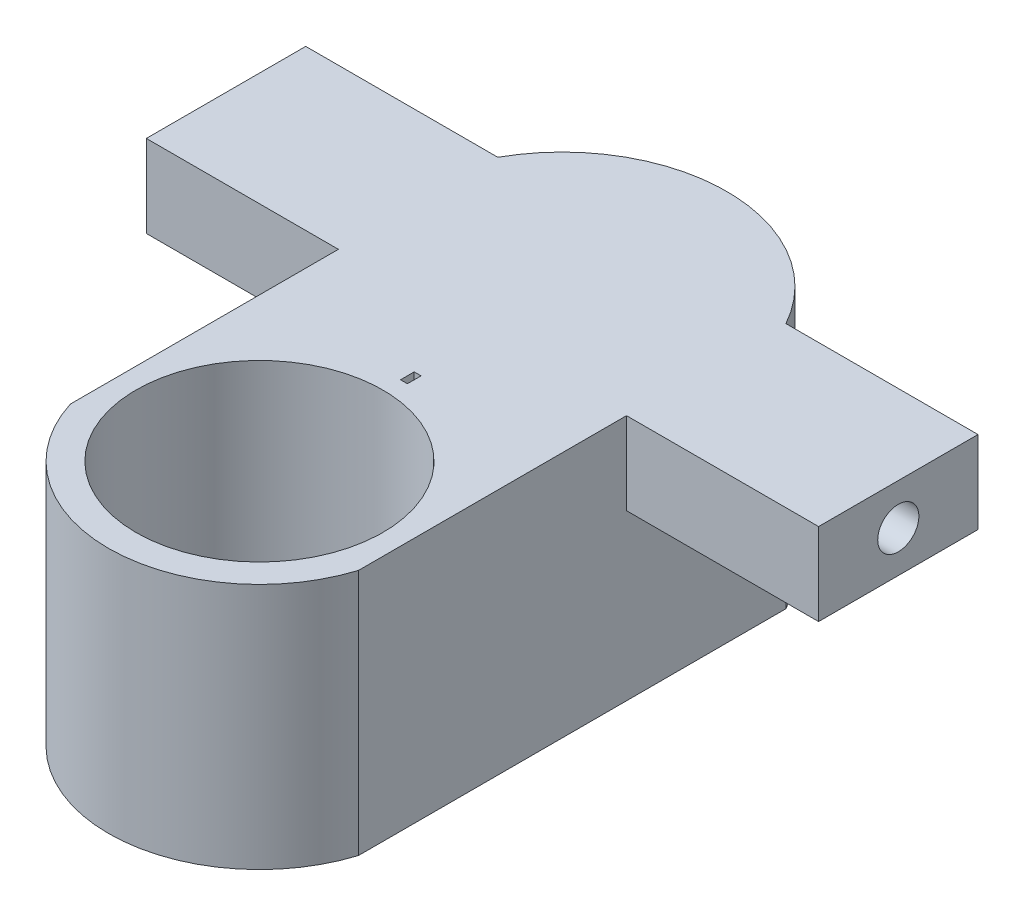
ISO-10303-21;
HEADER;
FILE_DESCRIPTION(('STEP AP214'),'2;1');
FILE_NAME('part.step','',(''),(''),'','','');
FILE_SCHEMA(('AUTOMOTIVE_DESIGN { 1 0 10303 214 1 1 1 1 }'));
ENDSEC;
DATA;
#1=APPLICATION_CONTEXT('core data for automotive mechanical design processes');
#2=APPLICATION_PROTOCOL_DEFINITION('international standard','automotive_design',2000,#1);
#3=PRODUCT_CONTEXT('',#1,'mechanical');
#4=PRODUCT('Part','Part','',(#3));
#5=PRODUCT_RELATED_PRODUCT_CATEGORY('part','',(#4));
#6=PRODUCT_DEFINITION_FORMATION('','',#4);
#7=PRODUCT_DEFINITION_CONTEXT('part definition',#1,'design');
#8=PRODUCT_DEFINITION('design','',#6,#7);
#9=PRODUCT_DEFINITION_SHAPE('','',#8);
#10=(LENGTH_UNIT() NAMED_UNIT(*) SI_UNIT(.MILLI.,.METRE.));
#11=(NAMED_UNIT(*) PLANE_ANGLE_UNIT() SI_UNIT($,.RADIAN.));
#12=(NAMED_UNIT(*) SI_UNIT($,.STERADIAN.) SOLID_ANGLE_UNIT());
#13=UNCERTAINTY_MEASURE_WITH_UNIT(LENGTH_MEASURE(1.E-05),#10,'distance_accuracy_value','');
#14=(GEOMETRIC_REPRESENTATION_CONTEXT(3) GLOBAL_UNCERTAINTY_ASSIGNED_CONTEXT((#13)) GLOBAL_UNIT_ASSIGNED_CONTEXT((#10,
#11,#12)) REPRESENTATION_CONTEXT('',''));
#15=CARTESIAN_POINT('',(0.,0.,0.));
#16=DIRECTION('',(0.,0.,1.));
#17=DIRECTION('',(1.,0.,0.));
#18=AXIS2_PLACEMENT_3D('',#15,#16,#17);
#19=CARTESIAN_POINT('',(-10.5,18.,0.));
#20=DIRECTION('',(-1.,0.,0.));
#21=DIRECTION('',(0.,0.,1.));
#22=AXIS2_PLACEMENT_3D('',#19,#20,#21);
#23=PLANE('',#22);
#24=DIRECTION('',(0.,0.,-1.));
#25=VECTOR('',#24,1.);
#26=CARTESIAN_POINT('',(-10.5,18.,0.));
#27=LINE('',#26,#25);
#28=CARTESIAN_POINT('',(-10.5,18.,25.3438942865219));
#29=VERTEX_POINT('',#28);
#30=CARTESIAN_POINT('',(-10.5,18.,5.80947501931112));
#31=VERTEX_POINT('',#30);
#32=EDGE_CURVE('E354',#29,#31,#27,.T.);
#33=ORIENTED_EDGE('',*,*,#32,.T.);
#34=DIRECTION('',(0.,-1.,0.));
#35=VECTOR('',#34,1.);
#36=CARTESIAN_POINT('',(-10.5,0.,5.80947501931112));
#37=LINE('',#36,#35);
#38=CARTESIAN_POINT('',(-10.5,12.,5.80947501931112));
#39=VERTEX_POINT('',#38);
#40=EDGE_CURVE('E535',#31,#39,#37,.T.);
#41=ORIENTED_EDGE('',*,*,#40,.T.);
#42=DIRECTION('',(0.,0.,1.));
#43=VECTOR('',#42,1.);
#44=CARTESIAN_POINT('',(-10.5,12.,0.));
#45=LINE('',#44,#43);
#46=CARTESIAN_POINT('',(-10.5,12.,-5.80947501931112));
#47=VERTEX_POINT('',#46);
#48=EDGE_CURVE('E549',#47,#39,#45,.T.);
#49=ORIENTED_EDGE('',*,*,#48,.F.);
#50=DIRECTION('',(0.,1.,0.));
#51=VECTOR('',#50,1.);
#52=CARTESIAN_POINT('',(-10.5,-34.,-5.80947501931112));
#53=LINE('',#52,#51);
#54=CARTESIAN_POINT('',(-10.5,0.,-5.80947501931112));
#55=VERTEX_POINT('',#54);
#56=EDGE_CURVE('E587',#55,#47,#53,.T.);
#57=ORIENTED_EDGE('',*,*,#56,.F.);
#58=DIRECTION('',(0.,0.,-1.));
#59=VECTOR('',#58,1.);
#60=CARTESIAN_POINT('',(-10.5,0.,0.));
#61=LINE('',#60,#59);
#62=CARTESIAN_POINT('',(-10.5,0.,25.3438942865219));
#63=VERTEX_POINT('',#62);
#64=EDGE_CURVE('E622',#63,#55,#61,.T.);
#65=ORIENTED_EDGE('',*,*,#64,.F.);
#66=DIRECTION('',(0.,1.,0.));
#67=VECTOR('',#66,1.);
#68=CARTESIAN_POINT('',(-10.5,-34.,25.3438942865219));
#69=LINE('',#68,#67);
#70=EDGE_CURVE('E594',#63,#29,#69,.T.);
#71=ORIENTED_EDGE('',*,*,#70,.T.);
#72=EDGE_LOOP('',(#33,#41,#49,#57,#65,#71));
#73=FACE_BOUND('',#72,.T.);
#74=ADVANCED_FACE('F345',(#73),#23,.T.);
#75=CARTESIAN_POINT('',(0.,0.,0.));
#76=DIRECTION('',(0.,1.,0.));
#77=DIRECTION('',(0.,0.,1.));
#78=AXIS2_PLACEMENT_3D('',#75,#76,#77);
#79=PLANE('',#78);
#80=CARTESIAN_POINT('',(0.,0.,22.0651750243709));
#81=DIRECTION('',(0.,1.,0.));
#82=DIRECTION('',(0.,0.,1.));
#83=AXIS2_PLACEMENT_3D('',#80,#81,#82);
#84=CIRCLE('',#83,9.);
#85=CARTESIAN_POINT('',(0.,0.,31.0651750243709));
#86=VERTEX_POINT('',#85);
#87=EDGE_CURVE('E614',#86,#86,#84,.T.);
#88=ORIENTED_EDGE('',*,*,#87,.T.);
#89=EDGE_LOOP('',(#88));
#90=FACE_BOUND('',#89,.T.);
#91=CARTESIAN_POINT('',(0.,0.,0.));
#92=DIRECTION('',(0.,1.,0.));
#93=DIRECTION('',(0.,0.,1.));
#94=AXIS2_PLACEMENT_3D('',#91,#92,#93);
#95=CIRCLE('',#94,12.);
#96=CARTESIAN_POINT('',(10.5,0.,-5.80947501931112));
#97=VERTEX_POINT('',#96);
#98=EDGE_CURVE('E591',#97,#55,#95,.T.);
#99=ORIENTED_EDGE('',*,*,#98,.F.);
#100=DIRECTION('',(0.,0.,1.));
#101=VECTOR('',#100,1.);
#102=CARTESIAN_POINT('',(10.5,0.,0.));
#103=LINE('',#102,#101);
#104=CARTESIAN_POINT('',(10.5,0.,25.3438942865219));
#105=VERTEX_POINT('',#104);
#106=EDGE_CURVE('E618',#97,#105,#103,.T.);
#107=ORIENTED_EDGE('',*,*,#106,.T.);
#108=CARTESIAN_POINT('',(0.,0.,22.0651750243709));
#109=DIRECTION('',(0.,1.,0.));
#110=DIRECTION('',(0.,0.,1.));
#111=AXIS2_PLACEMENT_3D('',#108,#109,#110);
#112=CIRCLE('',#111,11.);
#113=EDGE_CURVE('E610',#63,#105,#112,.T.);
#114=ORIENTED_EDGE('',*,*,#113,.F.);
#115=ORIENTED_EDGE('',*,*,#64,.T.);
#116=EDGE_LOOP('',(#99,#107,#114,#115));
#117=FACE_BOUND('',#116,.T.);
#118=ADVANCED_FACE('F630',(#90,#117),#79,.F.);
#119=CARTESIAN_POINT('',(0.,18.,0.));
#120=DIRECTION('',(0.,1.,0.));
#121=DIRECTION('',(0.,0.,1.));
#122=AXIS2_PLACEMENT_3D('',#119,#120,#121);
#123=PLANE('',#122);
#124=DIRECTION('',(0.,0.,-1.));
#125=VECTOR('',#124,1.);
#126=CARTESIAN_POINT('',(0.500000000000005,18.,0.));
#127=LINE('',#126,#125);
#128=CARTESIAN_POINT('',(0.500000000000005,18.,11.7825875121855));
#129=VERTEX_POINT('',#128);
#130=CARTESIAN_POINT('',(0.500000000000005,18.,10.7825875121855));
#131=VERTEX_POINT('',#130);
#132=EDGE_CURVE('E369',#129,#131,#127,.T.);
#133=ORIENTED_EDGE('',*,*,#132,.F.);
#134=DIRECTION('',(1.,0.,0.));
#135=VECTOR('',#134,1.);
#136=CARTESIAN_POINT('',(0.,18.,11.7825875121855));
#137=LINE('',#136,#135);
#138=CARTESIAN_POINT('',(0.,18.,11.7825875121855));
#139=VERTEX_POINT('',#138);
#140=EDGE_CURVE('E506',#139,#129,#137,.T.);
#141=ORIENTED_EDGE('',*,*,#140,.F.);
#142=DIRECTION('',(0.,0.,1.));
#143=VECTOR('',#142,1.);
#144=CARTESIAN_POINT('',(0.,18.,0.));
#145=LINE('',#144,#143);
#146=CARTESIAN_POINT('',(0.,18.,10.7825875121855));
#147=VERTEX_POINT('',#146);
#148=EDGE_CURVE('E525',#147,#139,#145,.T.);
#149=ORIENTED_EDGE('',*,*,#148,.F.);
#150=DIRECTION('',(-1.,0.,0.));
#151=VECTOR('',#150,1.);
#152=CARTESIAN_POINT('',(0.,18.,10.7825875121855));
#153=LINE('',#152,#151);
#154=EDGE_CURVE('E521',#131,#147,#153,.T.);
#155=ORIENTED_EDGE('',*,*,#154,.F.);
#156=EDGE_LOOP('',(#133,#141,#149,#155));
#157=FACE_BOUND('',#156,.T.);
#158=CARTESIAN_POINT('',(0.,18.,22.0651750243709));
#159=DIRECTION('',(0.,1.,0.));
#160=DIRECTION('',(0.,0.,1.));
#161=AXIS2_PLACEMENT_3D('',#158,#159,#160);
#162=CIRCLE('',#161,9.);
#163=CARTESIAN_POINT('',(0.,18.,31.0651750243709));
#164=VERTEX_POINT('',#163);
#165=EDGE_CURVE('E606',#164,#164,#162,.T.);
#166=ORIENTED_EDGE('',*,*,#165,.F.);
#167=EDGE_LOOP('',(#166));
#168=FACE_BOUND('',#167,.T.);
#169=DIRECTION('',(0.,0.,1.));
#170=VECTOR('',#169,1.);
#171=CARTESIAN_POINT('',(10.5,18.,0.));
#172=LINE('',#171,#170);
#173=CARTESIAN_POINT('',(10.5,18.,5.8094750193111));
#174=VERTEX_POINT('',#173);
#175=CARTESIAN_POINT('',(10.5,18.,25.3438942865219));
#176=VERTEX_POINT('',#175);
#177=EDGE_CURVE('E619',#174,#176,#172,.T.);
#178=ORIENTED_EDGE('',*,*,#177,.F.);
#179=DIRECTION('',(-1.,0.,0.));
#180=VECTOR('',#179,1.);
#181=CARTESIAN_POINT('',(24.5,18.,5.80947501931107));
#182=LINE('',#181,#180);
#183=CARTESIAN_POINT('',(24.5,18.,5.80947501931107));
#184=VERTEX_POINT('',#183);
#185=EDGE_CURVE('E484',#184,#174,#182,.T.);
#186=ORIENTED_EDGE('',*,*,#185,.F.);
#187=DIRECTION('',(0.,0.,-1.));
#188=VECTOR('',#187,1.);
#189=CARTESIAN_POINT('',(24.5,18.,0.));
#190=LINE('',#189,#188);
#191=CARTESIAN_POINT('',(24.5,18.,-5.80947501931117));
#192=VERTEX_POINT('',#191);
#193=EDGE_CURVE('E462',#184,#192,#190,.T.);
#194=ORIENTED_EDGE('',*,*,#193,.T.);
#195=DIRECTION('',(-1.,0.,0.));
#196=VECTOR('',#195,1.);
#197=CARTESIAN_POINT('',(24.5,18.,-5.80947501931117));
#198=LINE('',#197,#196);
#199=CARTESIAN_POINT('',(10.5,18.,-5.80947501931114));
#200=VERTEX_POINT('',#199);
#201=EDGE_CURVE('E496',#192,#200,#198,.T.);
#202=ORIENTED_EDGE('',*,*,#201,.T.);
#203=CARTESIAN_POINT('',(0.,18.,0.));
#204=DIRECTION('',(0.,1.,0.));
#205=DIRECTION('',(0.,0.,1.));
#206=AXIS2_PLACEMENT_3D('',#203,#204,#205);
#207=CIRCLE('',#206,12.);
#208=CARTESIAN_POINT('',(-10.5,18.,-5.80947501931112));
#209=VERTEX_POINT('',#208);
#210=EDGE_CURVE('E583',#200,#209,#207,.T.);
#211=ORIENTED_EDGE('',*,*,#210,.T.);
#212=DIRECTION('',(1.,0.,0.));
#213=VECTOR('',#212,1.);
#214=CARTESIAN_POINT('',(-24.5,18.,-5.80947501931112));
#215=LINE('',#214,#213);
#216=CARTESIAN_POINT('',(-24.5,18.,-5.80947501931112));
#217=VERTEX_POINT('',#216);
#218=EDGE_CURVE('E575',#217,#209,#215,.T.);
#219=ORIENTED_EDGE('',*,*,#218,.F.);
#220=DIRECTION('',(0.,0.,-1.));
#221=VECTOR('',#220,1.);
#222=CARTESIAN_POINT('',(-24.5,18.,0.));
#223=LINE('',#222,#221);
#224=CARTESIAN_POINT('',(-24.5,18.,5.80947501931112));
#225=VERTEX_POINT('',#224);
#226=EDGE_CURVE('E548',#225,#217,#223,.T.);
#227=ORIENTED_EDGE('',*,*,#226,.F.);
#228=DIRECTION('',(1.,0.,0.));
#229=VECTOR('',#228,1.);
#230=CARTESIAN_POINT('',(-24.5,18.,5.80947501931112));
#231=LINE('',#230,#229);
#232=EDGE_CURVE('E579',#225,#31,#231,.T.);
#233=ORIENTED_EDGE('',*,*,#232,.T.);
#234=ORIENTED_EDGE('',*,*,#32,.F.);
#235=CARTESIAN_POINT('',(0.,18.,22.0651750243709));
#236=DIRECTION('',(0.,1.,0.));
#237=DIRECTION('',(0.,0.,1.));
#238=AXIS2_PLACEMENT_3D('',#235,#236,#237);
#239=CIRCLE('',#238,11.);
#240=EDGE_CURVE('E598',#29,#176,#239,.T.);
#241=ORIENTED_EDGE('',*,*,#240,.T.);
#242=EDGE_LOOP('',(#178,#186,#194,#202,#211,#219,#227,#233,#234,#241));
#243=FACE_BOUND('',#242,.T.);
#244=ADVANCED_FACE('F654',(#157,#168,#243),#123,.T.);
#245=CARTESIAN_POINT('',(10.5,18.,0.));
#246=DIRECTION('',(1.,0.,0.));
#247=DIRECTION('',(0.,0.,-1.));
#248=AXIS2_PLACEMENT_3D('',#245,#246,#247);
#249=PLANE('',#248);
#250=DIRECTION('',(0.,-1.,0.));
#251=VECTOR('',#250,1.);
#252=CARTESIAN_POINT('',(10.5,0.,5.8094750193111));
#253=LINE('',#252,#251);
#254=CARTESIAN_POINT('',(10.5,12.,5.8094750193111));
#255=VERTEX_POINT('',#254);
#256=EDGE_CURVE('E361',#174,#255,#253,.T.);
#257=ORIENTED_EDGE('',*,*,#256,.F.);
#258=ORIENTED_EDGE('',*,*,#177,.T.);
#259=DIRECTION('',(0.,1.,0.));
#260=VECTOR('',#259,1.);
#261=CARTESIAN_POINT('',(10.5,-34.,25.3438942865219));
#262=LINE('',#261,#260);
#263=EDGE_CURVE('E602',#105,#176,#262,.T.);
#264=ORIENTED_EDGE('',*,*,#263,.F.);
#265=ORIENTED_EDGE('',*,*,#106,.F.);
#266=DIRECTION('',(0.,1.,0.));
#267=VECTOR('',#266,1.);
#268=CARTESIAN_POINT('',(10.5,-34.,-5.80947501931112));
#269=LINE('',#268,#267);
#270=CARTESIAN_POINT('',(10.5,12.,-5.80947501931114));
#271=VERTEX_POINT('',#270);
#272=EDGE_CURVE('E12',#97,#271,#269,.T.);
#273=ORIENTED_EDGE('',*,*,#272,.T.);
#274=DIRECTION('',(0.,0.,1.));
#275=VECTOR('',#274,1.);
#276=CARTESIAN_POINT('',(10.5,12.,0.));
#277=LINE('',#276,#275);
#278=EDGE_CURVE('E487',#271,#255,#277,.T.);
#279=ORIENTED_EDGE('',*,*,#278,.T.);
#280=EDGE_LOOP('',(#257,#258,#264,#265,#273,#279));
#281=FACE_BOUND('',#280,.T.);
#282=ADVANCED_FACE('F347',(#281),#249,.T.);
#283=CARTESIAN_POINT('',(0.,-34.,22.0651750243709));
#284=DIRECTION('',(0.,1.,0.));
#285=DIRECTION('',(0.,0.,1.));
#286=AXIS2_PLACEMENT_3D('',#283,#284,#285);
#287=CYLINDRICAL_SURFACE('',#286,11.);
#288=ORIENTED_EDGE('',*,*,#113,.T.);
#289=ORIENTED_EDGE('',*,*,#263,.T.);
#290=ORIENTED_EDGE('',*,*,#240,.F.);
#291=ORIENTED_EDGE('',*,*,#70,.F.);
#292=EDGE_LOOP('',(#288,#289,#290,#291));
#293=FACE_BOUND('',#292,.T.);
#294=ADVANCED_FACE('F661',(#293),#287,.T.);
#295=CARTESIAN_POINT('',(0.,-34.,22.0651750243709));
#296=DIRECTION('',(0.,1.,0.));
#297=DIRECTION('',(0.,0.,1.));
#298=AXIS2_PLACEMENT_3D('',#295,#296,#297);
#299=CYLINDRICAL_SURFACE('',#298,9.);
#300=ORIENTED_EDGE('',*,*,#165,.T.);
#301=EDGE_LOOP('',(#300));
#302=FACE_BOUND('',#301,.T.);
#303=ORIENTED_EDGE('',*,*,#87,.F.);
#304=EDGE_LOOP('',(#303));
#305=FACE_BOUND('',#304,.T.);
#306=ADVANCED_FACE('F672',(#302,#305),#299,.F.);
#307=CARTESIAN_POINT('',(0.,-34.,0.));
#308=DIRECTION('',(0.,1.,0.));
#309=DIRECTION('',(0.,0.,1.));
#310=AXIS2_PLACEMENT_3D('',#307,#308,#309);
#311=CYLINDRICAL_SURFACE('',#310,12.);
#312=ORIENTED_EDGE('',*,*,#98,.T.);
#313=ORIENTED_EDGE('',*,*,#56,.T.);
#314=DIRECTION('',(0.,-1.,0.));
#315=VECTOR('',#314,1.);
#316=CARTESIAN_POINT('',(-10.5,0.,-5.80947501931112));
#317=LINE('',#316,#315);
#318=EDGE_CURVE('E561',#209,#47,#317,.T.);
#319=ORIENTED_EDGE('',*,*,#318,.F.);
#320=ORIENTED_EDGE('',*,*,#210,.F.);
#321=DIRECTION('',(0.,-1.,0.));
#322=VECTOR('',#321,1.);
#323=CARTESIAN_POINT('',(10.5,0.,-5.80947501931114));
#324=LINE('',#323,#322);
#325=EDGE_CURVE('E464',#200,#271,#324,.T.);
#326=ORIENTED_EDGE('',*,*,#325,.T.);
#327=ORIENTED_EDGE('',*,*,#272,.F.);
#328=EDGE_LOOP('',(#312,#313,#319,#320,#326,#327));
#329=FACE_BOUND('',#328,.T.);
#330=ADVANCED_FACE('F637',(#329),#311,.T.);
#331=CARTESIAN_POINT('',(-24.5,0.,5.80947501931112));
#332=DIRECTION('',(0.,0.,1.));
#333=DIRECTION('',(0.,-1.,0.));
#334=AXIS2_PLACEMENT_3D('',#331,#332,#333);
#335=PLANE('',#334);
#336=ORIENTED_EDGE('',*,*,#40,.F.);
#337=ORIENTED_EDGE('',*,*,#232,.F.);
#338=DIRECTION('',(0.,-1.,0.));
#339=VECTOR('',#338,1.);
#340=CARTESIAN_POINT('',(-24.5,0.,5.80947501931112));
#341=LINE('',#340,#339);
#342=CARTESIAN_POINT('',(-24.5,12.,5.80947501931112));
#343=VERTEX_POINT('',#342);
#344=EDGE_CURVE('E544',#225,#343,#341,.T.);
#345=ORIENTED_EDGE('',*,*,#344,.T.);
#346=DIRECTION('',(1.,0.,0.));
#347=VECTOR('',#346,1.);
#348=CARTESIAN_POINT('',(-24.5,12.,5.80947501931112));
#349=LINE('',#348,#347);
#350=EDGE_CURVE('E558',#343,#39,#349,.T.);
#351=ORIENTED_EDGE('',*,*,#350,.T.);
#352=EDGE_LOOP('',(#336,#337,#345,#351));
#353=FACE_BOUND('',#352,.T.);
#354=ADVANCED_FACE('F664',(#353),#335,.T.);
#355=CARTESIAN_POINT('',(-24.5,0.,-5.80947501931112));
#356=DIRECTION('',(0.,0.,1.));
#357=DIRECTION('',(1.,0.,0.));
#358=AXIS2_PLACEMENT_3D('',#355,#356,#357);
#359=PLANE('',#358);
#360=ORIENTED_EDGE('',*,*,#318,.T.);
#361=DIRECTION('',(1.,0.,0.));
#362=VECTOR('',#361,1.);
#363=CARTESIAN_POINT('',(-24.5,12.,-5.80947501931112));
#364=LINE('',#363,#362);
#365=CARTESIAN_POINT('',(-24.5,12.,-5.80947501931112));
#366=VERTEX_POINT('',#365);
#367=EDGE_CURVE('E571',#366,#47,#364,.T.);
#368=ORIENTED_EDGE('',*,*,#367,.F.);
#369=DIRECTION('',(0.,-1.,0.));
#370=VECTOR('',#369,1.);
#371=CARTESIAN_POINT('',(-24.5,0.,-5.80947501931112));
#372=LINE('',#371,#370);
#373=EDGE_CURVE('E552',#217,#366,#372,.T.);
#374=ORIENTED_EDGE('',*,*,#373,.F.);
#375=ORIENTED_EDGE('',*,*,#218,.T.);
#376=EDGE_LOOP('',(#360,#368,#374,#375));
#377=FACE_BOUND('',#376,.T.);
#378=ADVANCED_FACE('F641',(#377),#359,.F.);
#379=CARTESIAN_POINT('',(-24.5,12.,0.));
#380=DIRECTION('',(0.,1.,0.));
#381=DIRECTION('',(0.,0.,1.));
#382=AXIS2_PLACEMENT_3D('',#379,#380,#381);
#383=PLANE('',#382);
#384=ORIENTED_EDGE('',*,*,#48,.T.);
#385=ORIENTED_EDGE('',*,*,#350,.F.);
#386=DIRECTION('',(0.,0.,1.));
#387=VECTOR('',#386,1.);
#388=CARTESIAN_POINT('',(-24.5,12.,0.));
#389=LINE('',#388,#387);
#390=EDGE_CURVE('E555',#366,#343,#389,.T.);
#391=ORIENTED_EDGE('',*,*,#390,.F.);
#392=ORIENTED_EDGE('',*,*,#367,.T.);
#393=EDGE_LOOP('',(#384,#385,#391,#392));
#394=FACE_BOUND('',#393,.T.);
#395=ADVANCED_FACE('F646',(#394),#383,.F.);
#396=CARTESIAN_POINT('',(-24.5,0.,0.));
#397=DIRECTION('',(-1.,0.,0.));
#398=DIRECTION('',(0.,0.,1.));
#399=AXIS2_PLACEMENT_3D('',#396,#397,#398);
#400=PLANE('',#399);
#401=CARTESIAN_POINT('',(-24.5,15.,0.));
#402=DIRECTION('',(-1.,0.,0.));
#403=DIRECTION('',(0.,0.,1.));
#404=AXIS2_PLACEMENT_3D('',#401,#402,#403);
#405=CIRCLE('',#404,1.5);
#406=CARTESIAN_POINT('',(-24.5,15.,1.5));
#407=VERTEX_POINT('',#406);
#408=EDGE_CURVE('E989',#407,#407,#405,.T.);
#409=ORIENTED_EDGE('',*,*,#408,.F.);
#410=EDGE_LOOP('',(#409));
#411=FACE_BOUND('',#410,.T.);
#412=ORIENTED_EDGE('',*,*,#344,.F.);
#413=ORIENTED_EDGE('',*,*,#226,.T.);
#414=ORIENTED_EDGE('',*,*,#373,.T.);
#415=ORIENTED_EDGE('',*,*,#390,.T.);
#416=EDGE_LOOP('',(#412,#413,#414,#415));
#417=FACE_BOUND('',#416,.T.);
#418=ADVANCED_FACE('F650',(#411,#417),#400,.T.);
#419=CARTESIAN_POINT('',(0.500000000000005,17.5,0.));
#420=DIRECTION('',(1.,0.,0.));
#421=DIRECTION('',(0.,0.,-1.));
#422=AXIS2_PLACEMENT_3D('',#419,#420,#421);
#423=PLANE('',#422);
#424=ORIENTED_EDGE('',*,*,#132,.T.);
#425=DIRECTION('',(0.,1.,0.));
#426=VECTOR('',#425,1.);
#427=CARTESIAN_POINT('',(0.500000000000005,17.5,10.7825875121855));
#428=LINE('',#427,#426);
#429=CARTESIAN_POINT('',(0.500000000000005,17.5,10.7825875121855));
#430=VERTEX_POINT('',#429);
#431=EDGE_CURVE('E518',#430,#131,#428,.T.);
#432=ORIENTED_EDGE('',*,*,#431,.F.);
#433=DIRECTION('',(0.,0.,-1.));
#434=VECTOR('',#433,1.);
#435=CARTESIAN_POINT('',(0.500000000000005,17.5,0.));
#436=LINE('',#435,#434);
#437=CARTESIAN_POINT('',(0.500000000000005,17.5,11.7825875121855));
#438=VERTEX_POINT('',#437);
#439=EDGE_CURVE('E501',#438,#430,#436,.T.);
#440=ORIENTED_EDGE('',*,*,#439,.F.);
#441=DIRECTION('',(0.,1.,0.));
#442=VECTOR('',#441,1.);
#443=CARTESIAN_POINT('',(0.500000000000005,17.5,11.7825875121855));
#444=LINE('',#443,#442);
#445=EDGE_CURVE('E532',#438,#129,#444,.T.);
#446=ORIENTED_EDGE('',*,*,#445,.T.);
#447=EDGE_LOOP('',(#424,#432,#440,#446));
#448=FACE_BOUND('',#447,.T.);
#449=ADVANCED_FACE('F743',(#448),#423,.F.);
#450=CARTESIAN_POINT('',(0.,17.5,11.7825875121855));
#451=DIRECTION('',(0.,0.,1.));
#452=DIRECTION('',(1.,0.,0.));
#453=AXIS2_PLACEMENT_3D('',#450,#451,#452);
#454=PLANE('',#453);
#455=ORIENTED_EDGE('',*,*,#140,.T.);
#456=ORIENTED_EDGE('',*,*,#445,.F.);
#457=DIRECTION('',(1.,0.,0.));
#458=VECTOR('',#457,1.);
#459=CARTESIAN_POINT('',(0.,17.5,11.7825875121855));
#460=LINE('',#459,#458);
#461=CARTESIAN_POINT('',(0.,17.5,11.7825875121855));
#462=VERTEX_POINT('',#461);
#463=EDGE_CURVE('E514',#462,#438,#460,.T.);
#464=ORIENTED_EDGE('',*,*,#463,.F.);
#465=DIRECTION('',(0.,1.,0.));
#466=VECTOR('',#465,1.);
#467=CARTESIAN_POINT('',(0.,17.5,11.7825875121855));
#468=LINE('',#467,#466);
#469=EDGE_CURVE('E536',#462,#139,#468,.T.);
#470=ORIENTED_EDGE('',*,*,#469,.T.);
#471=EDGE_LOOP('',(#455,#456,#464,#470));
#472=FACE_BOUND('',#471,.T.);
#473=ADVANCED_FACE('F748',(#472),#454,.F.);
#474=CARTESIAN_POINT('',(0.,17.5,0.));
#475=DIRECTION('',(-1.,0.,0.));
#476=DIRECTION('',(0.,0.,1.));
#477=AXIS2_PLACEMENT_3D('',#474,#475,#476);
#478=PLANE('',#477);
#479=ORIENTED_EDGE('',*,*,#148,.T.);
#480=ORIENTED_EDGE('',*,*,#469,.F.);
#481=DIRECTION('',(0.,0.,1.));
#482=VECTOR('',#481,1.);
#483=CARTESIAN_POINT('',(0.,17.5,0.));
#484=LINE('',#483,#482);
#485=CARTESIAN_POINT('',(0.,17.5,10.7825875121855));
#486=VERTEX_POINT('',#485);
#487=EDGE_CURVE('E510',#486,#462,#484,.T.);
#488=ORIENTED_EDGE('',*,*,#487,.F.);
#489=DIRECTION('',(0.,1.,0.));
#490=VECTOR('',#489,1.);
#491=CARTESIAN_POINT('',(0.,17.5,10.7825875121855));
#492=LINE('',#491,#490);
#493=EDGE_CURVE('E539',#486,#147,#492,.T.);
#494=ORIENTED_EDGE('',*,*,#493,.T.);
#495=EDGE_LOOP('',(#479,#480,#488,#494));
#496=FACE_BOUND('',#495,.T.);
#497=ADVANCED_FACE('F759',(#496),#478,.F.);
#498=CARTESIAN_POINT('',(0.,17.5,10.7825875121855));
#499=DIRECTION('',(0.,0.,-1.));
#500=DIRECTION('',(-1.,0.,0.));
#501=AXIS2_PLACEMENT_3D('',#498,#499,#500);
#502=PLANE('',#501);
#503=ORIENTED_EDGE('',*,*,#154,.T.);
#504=ORIENTED_EDGE('',*,*,#493,.F.);
#505=DIRECTION('',(-1.,0.,0.));
#506=VECTOR('',#505,1.);
#507=CARTESIAN_POINT('',(0.,17.5,10.7825875121855));
#508=LINE('',#507,#506);
#509=EDGE_CURVE('E505',#430,#486,#508,.T.);
#510=ORIENTED_EDGE('',*,*,#509,.F.);
#511=ORIENTED_EDGE('',*,*,#431,.T.);
#512=EDGE_LOOP('',(#503,#504,#510,#511));
#513=FACE_BOUND('',#512,.T.);
#514=ADVANCED_FACE('F771',(#513),#502,.F.);
#515=CARTESIAN_POINT('',(0.,17.5,0.));
#516=DIRECTION('',(0.,1.,0.));
#517=DIRECTION('',(0.,0.,1.));
#518=AXIS2_PLACEMENT_3D('',#515,#516,#517);
#519=PLANE('',#518);
#520=ORIENTED_EDGE('',*,*,#439,.T.);
#521=ORIENTED_EDGE('',*,*,#509,.T.);
#522=ORIENTED_EDGE('',*,*,#487,.T.);
#523=ORIENTED_EDGE('',*,*,#463,.T.);
#524=EDGE_LOOP('',(#520,#521,#522,#523));
#525=FACE_BOUND('',#524,.T.);
#526=ADVANCED_FACE('F780',(#525),#519,.T.);
#527=CARTESIAN_POINT('',(24.5,0.,5.80947501931108));
#528=DIRECTION('',(0.,0.,-1.));
#529=DIRECTION('',(-1.,0.,0.));
#530=AXIS2_PLACEMENT_3D('',#527,#528,#529);
#531=PLANE('',#530);
#532=ORIENTED_EDGE('',*,*,#256,.T.);
#533=DIRECTION('',(-1.,0.,0.));
#534=VECTOR('',#533,1.);
#535=CARTESIAN_POINT('',(24.5,12.,5.80947501931107));
#536=LINE('',#535,#534);
#537=CARTESIAN_POINT('',(24.5,12.,5.80947501931107));
#538=VERTEX_POINT('',#537);
#539=EDGE_CURVE('E466',#538,#255,#536,.T.);
#540=ORIENTED_EDGE('',*,*,#539,.F.);
#541=DIRECTION('',(0.,-1.,0.));
#542=VECTOR('',#541,1.);
#543=CARTESIAN_POINT('',(24.5,0.,5.80947501931108));
#544=LINE('',#543,#542);
#545=EDGE_CURVE('E455',#184,#538,#544,.T.);
#546=ORIENTED_EDGE('',*,*,#545,.F.);
#547=ORIENTED_EDGE('',*,*,#185,.T.);
#548=EDGE_LOOP('',(#532,#540,#546,#547));
#549=FACE_BOUND('',#548,.T.);
#550=ADVANCED_FACE('F467',(#549),#531,.F.);
#551=CARTESIAN_POINT('',(24.5,12.,0.));
#552=DIRECTION('',(0.,-1.,0.));
#553=DIRECTION('',(0.,0.,-1.));
#554=AXIS2_PLACEMENT_3D('',#551,#552,#553);
#555=PLANE('',#554);
#556=ORIENTED_EDGE('',*,*,#278,.F.);
#557=DIRECTION('',(-1.,0.,0.));
#558=VECTOR('',#557,1.);
#559=CARTESIAN_POINT('',(24.5,12.,-5.80947501931117));
#560=LINE('',#559,#558);
#561=CARTESIAN_POINT('',(24.5,12.,-5.80947501931117));
#562=VERTEX_POINT('',#561);
#563=EDGE_CURVE('E472',#562,#271,#560,.T.);
#564=ORIENTED_EDGE('',*,*,#563,.F.);
#565=DIRECTION('',(0.,0.,1.));
#566=VECTOR('',#565,1.);
#567=CARTESIAN_POINT('',(24.5,12.,0.));
#568=LINE('',#567,#566);
#569=EDGE_CURVE('E459',#562,#538,#568,.T.);
#570=ORIENTED_EDGE('',*,*,#569,.T.);
#571=ORIENTED_EDGE('',*,*,#539,.T.);
#572=EDGE_LOOP('',(#556,#564,#570,#571));
#573=FACE_BOUND('',#572,.T.);
#574=ADVANCED_FACE('F474',(#573),#555,.T.);
#575=CARTESIAN_POINT('',(24.5,0.,-5.80947501931117));
#576=DIRECTION('',(0.,0.,-1.));
#577=DIRECTION('',(-1.,0.,0.));
#578=AXIS2_PLACEMENT_3D('',#575,#576,#577);
#579=PLANE('',#578);
#580=ORIENTED_EDGE('',*,*,#325,.F.);
#581=ORIENTED_EDGE('',*,*,#201,.F.);
#582=DIRECTION('',(0.,-1.,0.));
#583=VECTOR('',#582,1.);
#584=CARTESIAN_POINT('',(24.5,0.,-5.80947501931117));
#585=LINE('',#584,#583);
#586=EDGE_CURVE('E476',#192,#562,#585,.T.);
#587=ORIENTED_EDGE('',*,*,#586,.T.);
#588=ORIENTED_EDGE('',*,*,#563,.T.);
#589=EDGE_LOOP('',(#580,#581,#587,#588));
#590=FACE_BOUND('',#589,.T.);
#591=ADVANCED_FACE('F807',(#590),#579,.T.);
#592=CARTESIAN_POINT('',(24.5,0.,0.));
#593=DIRECTION('',(1.,0.,0.));
#594=DIRECTION('',(0.,0.,1.));
#595=AXIS2_PLACEMENT_3D('',#592,#593,#594);
#596=PLANE('',#595);
#597=CARTESIAN_POINT('',(24.5,15.,0.));
#598=DIRECTION('',(-1.,0.,0.));
#599=DIRECTION('',(0.,0.,1.));
#600=AXIS2_PLACEMENT_3D('',#597,#598,#599);
#601=CIRCLE('',#600,1.5);
#602=CARTESIAN_POINT('',(24.5,15.,1.49999999999995));
#603=VERTEX_POINT('',#602);
#604=EDGE_CURVE('E998',#603,#603,#601,.T.);
#605=ORIENTED_EDGE('',*,*,#604,.T.);
#606=EDGE_LOOP('',(#605));
#607=FACE_BOUND('',#606,.T.);
#608=ORIENTED_EDGE('',*,*,#545,.T.);
#609=ORIENTED_EDGE('',*,*,#569,.F.);
#610=ORIENTED_EDGE('',*,*,#586,.F.);
#611=ORIENTED_EDGE('',*,*,#193,.F.);
#612=EDGE_LOOP('',(#608,#609,#610,#611));
#613=FACE_BOUND('',#612,.T.);
#614=ADVANCED_FACE('F456',(#607,#613),#596,.T.);
#615=CARTESIAN_POINT('',(-14.5,15.,0.));
#616=DIRECTION('',(-1.,0.,0.));
#617=DIRECTION('',(0.,0.,1.));
#618=AXIS2_PLACEMENT_3D('',#615,#616,#617);
#619=CYLINDRICAL_SURFACE('',#618,1.5);
#620=CARTESIAN_POINT('',(-14.5,15.,0.));
#621=DIRECTION('',(-1.,0.,0.));
#622=DIRECTION('',(0.,0.,1.));
#623=AXIS2_PLACEMENT_3D('',#620,#621,#622);
#624=CIRCLE('',#623,1.5);
#625=CARTESIAN_POINT('',(-14.5,15.,1.5));
#626=VERTEX_POINT('',#625);
#627=EDGE_CURVE('E488',#626,#626,#624,.T.);
#628=ORIENTED_EDGE('',*,*,#627,.F.);
#629=EDGE_LOOP('',(#628));
#630=FACE_BOUND('',#629,.T.);
#631=ORIENTED_EDGE('',*,*,#408,.T.);
#632=EDGE_LOOP('',(#631));
#633=FACE_BOUND('',#632,.T.);
#634=ADVANCED_FACE('F821',(#630,#633),#619,.F.);
#635=CARTESIAN_POINT('',(-14.5,0.,0.));
#636=DIRECTION('',(-1.,0.,0.));
#637=DIRECTION('',(0.,0.,1.));
#638=AXIS2_PLACEMENT_3D('',#635,#636,#637);
#639=PLANE('',#638);
#640=ORIENTED_EDGE('',*,*,#627,.T.);
#641=EDGE_LOOP('',(#640));
#642=FACE_BOUND('',#641,.T.);
#643=ADVANCED_FACE('F831',(#642),#639,.T.);
#644=CARTESIAN_POINT('',(14.5,15.,0.));
#645=DIRECTION('',(1.,0.,0.));
#646=DIRECTION('',(0.,0.,-1.));
#647=AXIS2_PLACEMENT_3D('',#644,#645,#646);
#648=CYLINDRICAL_SURFACE('',#647,1.5);
#649=CARTESIAN_POINT('',(14.5,15.,0.));
#650=DIRECTION('',(-1.,0.,0.));
#651=DIRECTION('',(0.,0.,1.));
#652=AXIS2_PLACEMENT_3D('',#649,#650,#651);
#653=CIRCLE('',#652,1.5);
#654=CARTESIAN_POINT('',(14.5,15.,1.49999999999997));
#655=VERTEX_POINT('',#654);
#656=EDGE_CURVE('E992',#655,#655,#653,.T.);
#657=ORIENTED_EDGE('',*,*,#656,.T.);
#658=EDGE_LOOP('',(#657));
#659=FACE_BOUND('',#658,.T.);
#660=ORIENTED_EDGE('',*,*,#604,.F.);
#661=EDGE_LOOP('',(#660));
#662=FACE_BOUND('',#661,.T.);
#663=ADVANCED_FACE('F838',(#659,#662),#648,.F.);
#664=CARTESIAN_POINT('',(14.5,0.,0.));
#665=DIRECTION('',(1.,0.,0.));
#666=DIRECTION('',(0.,0.,1.));
#667=AXIS2_PLACEMENT_3D('',#664,#665,#666);
#668=PLANE('',#667);
#669=ORIENTED_EDGE('',*,*,#656,.F.);
#670=EDGE_LOOP('',(#669));
#671=FACE_BOUND('',#670,.T.);
#672=ADVANCED_FACE('F845',(#671),#668,.T.);
#673=CLOSED_SHELL('',(#74,#118,#244,#282,#294,#306,#330,#354,#378,#395,#418,#449,#473,#497,#514,
#526,#550,#574,#591,#614,#634,#643,#663,#672));
#674=MANIFOLD_SOLID_BREP('B2',#673);
#675=ADVANCED_BREP_SHAPE_REPRESENTATION('',(#18,#674),#14);
#676=SHAPE_DEFINITION_REPRESENTATION(#9,#675);
ENDSEC;
END-ISO-10303-21;
